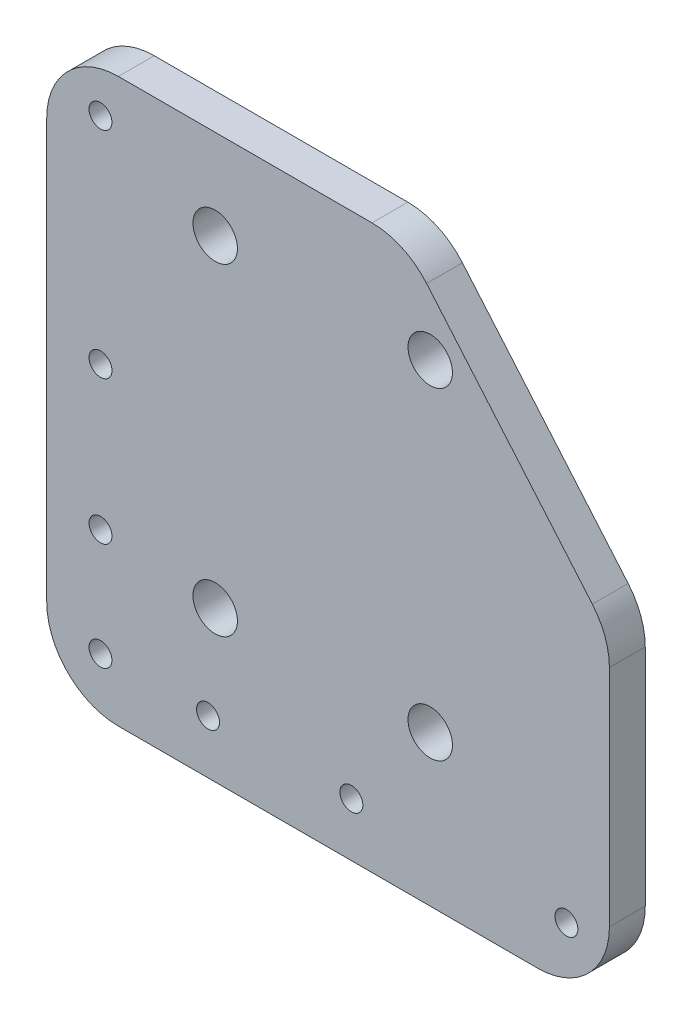
ISO-10303-21;
HEADER;
FILE_DESCRIPTION(('STEP AP214'),'2;1');
FILE_NAME('part.step','',(''),(''),'','','');
FILE_SCHEMA(('AUTOMOTIVE_DESIGN { 1 0 10303 214 1 1 1 1 }'));
ENDSEC;
DATA;
#1=APPLICATION_CONTEXT('core data for automotive mechanical design processes');
#2=APPLICATION_PROTOCOL_DEFINITION('international standard','automotive_design',2000,#1);
#3=PRODUCT_CONTEXT('',#1,'mechanical');
#4=PRODUCT('Part','Part','',(#3));
#5=PRODUCT_RELATED_PRODUCT_CATEGORY('part','',(#4));
#6=PRODUCT_DEFINITION_FORMATION('','',#4);
#7=PRODUCT_DEFINITION_CONTEXT('part definition',#1,'design');
#8=PRODUCT_DEFINITION('design','',#6,#7);
#9=PRODUCT_DEFINITION_SHAPE('','',#8);
#10=(LENGTH_UNIT() NAMED_UNIT(*) SI_UNIT(.MILLI.,.METRE.));
#11=(NAMED_UNIT(*) PLANE_ANGLE_UNIT() SI_UNIT($,.RADIAN.));
#12=(NAMED_UNIT(*) SI_UNIT($,.STERADIAN.) SOLID_ANGLE_UNIT());
#13=UNCERTAINTY_MEASURE_WITH_UNIT(LENGTH_MEASURE(1.E-05),#10,'distance_accuracy_value','');
#14=(GEOMETRIC_REPRESENTATION_CONTEXT(3) GLOBAL_UNCERTAINTY_ASSIGNED_CONTEXT((#13)) GLOBAL_UNIT_ASSIGNED_CONTEXT((#10,
#11,#12)) REPRESENTATION_CONTEXT('',''));
#15=CARTESIAN_POINT('',(0.,0.,0.));
#16=DIRECTION('',(0.,0.,1.));
#17=DIRECTION('',(1.,0.,0.));
#18=AXIS2_PLACEMENT_3D('',#15,#16,#17);
#19=CARTESIAN_POINT('',(0.,0.,5.));
#20=DIRECTION('',(0.,0.,1.));
#21=DIRECTION('',(1.,0.,0.));
#22=AXIS2_PLACEMENT_3D('',#19,#20,#21);
#23=PLANE('',#22);
#24=CARTESIAN_POINT('',(46.,13.5,5.));
#25=DIRECTION('',(0.,0.,1.));
#26=DIRECTION('',(1.,0.,0.));
#27=AXIS2_PLACEMENT_3D('',#24,#25,#26);
#28=CIRCLE('',#27,3.1);
#29=CARTESIAN_POINT('',(49.1,13.5,5.));
#30=VERTEX_POINT('',#29);
#31=EDGE_CURVE('E319',#30,#30,#28,.T.);
#32=ORIENTED_EDGE('',*,*,#31,.F.);
#33=EDGE_LOOP('',(#32));
#34=FACE_BOUND('',#33,.T.);
#35=CARTESIAN_POINT('',(16.,58.5,5.));
#36=DIRECTION('',(0.,0.,1.));
#37=DIRECTION('',(1.,0.,0.));
#38=AXIS2_PLACEMENT_3D('',#35,#36,#37);
#39=CIRCLE('',#38,3.1);
#40=CARTESIAN_POINT('',(19.1,58.5,5.));
#41=VERTEX_POINT('',#40);
#42=EDGE_CURVE('E303',#41,#41,#39,.T.);
#43=ORIENTED_EDGE('',*,*,#42,.F.);
#44=EDGE_LOOP('',(#43));
#45=FACE_BOUND('',#44,.T.);
#46=CARTESIAN_POINT('',(35.,0.,5.));
#47=DIRECTION('',(0.,0.,1.));
#48=DIRECTION('',(1.,0.,0.));
#49=AXIS2_PLACEMENT_3D('',#46,#47,#48);
#50=CIRCLE('',#49,1.60000000000001);
#51=CARTESIAN_POINT('',(36.6,0.,5.));
#52=VERTEX_POINT('',#51);
#53=EDGE_CURVE('E287',#52,#52,#50,.T.);
#54=ORIENTED_EDGE('',*,*,#53,.F.);
#55=EDGE_LOOP('',(#54));
#56=FACE_BOUND('',#55,.T.);
#57=CARTESIAN_POINT('',(0.,65.,5.));
#58=DIRECTION('',(0.,0.,1.));
#59=DIRECTION('',(1.,0.,0.));
#60=AXIS2_PLACEMENT_3D('',#57,#58,#59);
#61=CIRCLE('',#60,1.6);
#62=CARTESIAN_POINT('',(1.6,65.,5.));
#63=VERTEX_POINT('',#62);
#64=EDGE_CURVE('E271',#63,#63,#61,.T.);
#65=ORIENTED_EDGE('',*,*,#64,.F.);
#66=EDGE_LOOP('',(#65));
#67=FACE_BOUND('',#66,.T.);
#68=CARTESIAN_POINT('',(0.,15.,5.));
#69=DIRECTION('',(0.,0.,1.));
#70=DIRECTION('',(1.,0.,0.));
#71=AXIS2_PLACEMENT_3D('',#68,#69,#70);
#72=CIRCLE('',#71,1.6);
#73=CARTESIAN_POINT('',(1.60000000000001,15.,5.));
#74=VERTEX_POINT('',#73);
#75=EDGE_CURVE('E257',#74,#74,#72,.T.);
#76=ORIENTED_EDGE('',*,*,#75,.F.);
#77=EDGE_LOOP('',(#76));
#78=FACE_BOUND('',#77,.T.);
#79=DIRECTION('',(0.,1.,0.));
#80=VECTOR('',#79,1.);
#81=CARTESIAN_POINT('',(71.,-7.5,5.));
#82=LINE('',#81,#80);
#83=CARTESIAN_POINT('',(71.,2.5,5.));
#84=VERTEX_POINT('',#83);
#85=CARTESIAN_POINT('',(71.,33.8217714938602,5.));
#86=VERTEX_POINT('',#85);
#87=EDGE_CURVE('E244',#84,#86,#82,.T.);
#88=ORIENTED_EDGE('',*,*,#87,.T.);
#89=CARTESIAN_POINT('',(61.,33.8217714938602,5.));
#90=DIRECTION('',(0.,0.,1.));
#91=DIRECTION('',(1.,0.,0.));
#92=AXIS2_PLACEMENT_3D('',#89,#90,#91);
#93=CIRCLE('',#92,10.);
#94=CARTESIAN_POINT('',(68.6165875762404,40.3015549542438,5.));
#95=VERTEX_POINT('',#94);
#96=EDGE_CURVE('E193',#86,#95,#93,.T.);
#97=ORIENTED_EDGE('',*,*,#96,.T.);
#98=DIRECTION('',(-0.64797834603836,0.761658757624037,0.));
#99=VECTOR('',#98,1.);
#100=CARTESIAN_POINT('',(71.,37.5,5.));
#101=LINE('',#100,#99);
#102=CARTESIAN_POINT('',(45.4948110859423,67.4797834603836,5.));
#103=VERTEX_POINT('',#102);
#104=EDGE_CURVE('E144',#95,#103,#101,.T.);
#105=ORIENTED_EDGE('',*,*,#104,.T.);
#106=CARTESIAN_POINT('',(37.8782235097019,61.,5.));
#107=DIRECTION('',(0.,0.,1.));
#108=DIRECTION('',(1.,0.,0.));
#109=AXIS2_PLACEMENT_3D('',#106,#107,#108);
#110=CIRCLE('',#109,10.);
#111=CARTESIAN_POINT('',(37.8782235097019,71.,5.));
#112=VERTEX_POINT('',#111);
#113=EDGE_CURVE('E182',#103,#112,#110,.T.);
#114=ORIENTED_EDGE('',*,*,#113,.T.);
#115=DIRECTION('',(-1.,0.,0.));
#116=VECTOR('',#115,1.);
#117=CARTESIAN_POINT('',(42.5,71.,5.));
#118=LINE('',#117,#116);
#119=CARTESIAN_POINT('',(2.5,71.,5.));
#120=VERTEX_POINT('',#119);
#121=EDGE_CURVE('E153',#112,#120,#118,.T.);
#122=ORIENTED_EDGE('',*,*,#121,.T.);
#123=CARTESIAN_POINT('',(2.5,61.,5.));
#124=DIRECTION('',(0.,0.,1.));
#125=DIRECTION('',(1.,0.,0.));
#126=AXIS2_PLACEMENT_3D('',#123,#124,#125);
#127=CIRCLE('',#126,10.);
#128=CARTESIAN_POINT('',(-7.5,61.,5.));
#129=VERTEX_POINT('',#128);
#130=EDGE_CURVE('E185',#120,#129,#127,.T.);
#131=ORIENTED_EDGE('',*,*,#130,.T.);
#132=DIRECTION('',(0.,-1.,0.));
#133=VECTOR('',#132,1.);
#134=CARTESIAN_POINT('',(-7.5,71.,5.));
#135=LINE('',#134,#133);
#136=CARTESIAN_POINT('',(-7.49999999999999,2.5,5.));
#137=VERTEX_POINT('',#136);
#138=EDGE_CURVE('E159',#129,#137,#135,.T.);
#139=ORIENTED_EDGE('',*,*,#138,.T.);
#140=CARTESIAN_POINT('',(2.50000000000001,2.5,5.));
#141=DIRECTION('',(0.,0.,1.));
#142=DIRECTION('',(1.,0.,0.));
#143=AXIS2_PLACEMENT_3D('',#140,#141,#142);
#144=CIRCLE('',#143,10.);
#145=CARTESIAN_POINT('',(2.50000000000001,-7.5,5.));
#146=VERTEX_POINT('',#145);
#147=EDGE_CURVE('E67',#137,#146,#144,.T.);
#148=ORIENTED_EDGE('',*,*,#147,.T.);
#149=DIRECTION('',(1.,0.,0.));
#150=VECTOR('',#149,1.);
#151=CARTESIAN_POINT('',(-7.49999999999999,-7.5,5.));
#152=LINE('',#151,#150);
#153=CARTESIAN_POINT('',(61.,-7.5,5.));
#154=VERTEX_POINT('',#153);
#155=EDGE_CURVE('E245',#146,#154,#152,.T.);
#156=ORIENTED_EDGE('',*,*,#155,.T.);
#157=CARTESIAN_POINT('',(61.,2.5,5.));
#158=DIRECTION('',(0.,0.,1.));
#159=DIRECTION('',(1.,0.,0.));
#160=AXIS2_PLACEMENT_3D('',#157,#158,#159);
#161=CIRCLE('',#160,10.);
#162=EDGE_CURVE('E190',#154,#84,#161,.T.);
#163=ORIENTED_EDGE('',*,*,#162,.T.);
#164=EDGE_LOOP('',(#88,#97,#105,#114,#122,#131,#139,#148,#156,#163));
#165=FACE_BOUND('',#164,.T.);
#166=CARTESIAN_POINT('',(0.,0.,5.));
#167=DIRECTION('',(0.,0.,1.));
#168=DIRECTION('',(1.,0.,0.));
#169=AXIS2_PLACEMENT_3D('',#166,#167,#168);
#170=CIRCLE('',#169,1.6);
#171=CARTESIAN_POINT('',(1.6,0.,5.));
#172=VERTEX_POINT('',#171);
#173=EDGE_CURVE('E222',#172,#172,#170,.T.);
#174=ORIENTED_EDGE('',*,*,#173,.F.);
#175=EDGE_LOOP('',(#174));
#176=FACE_BOUND('',#175,.T.);
#177=CARTESIAN_POINT('',(0.,35.,5.));
#178=DIRECTION('',(0.,0.,1.));
#179=DIRECTION('',(1.,0.,0.));
#180=AXIS2_PLACEMENT_3D('',#177,#178,#179);
#181=CIRCLE('',#180,1.6);
#182=CARTESIAN_POINT('',(1.6,35.,5.));
#183=VERTEX_POINT('',#182);
#184=EDGE_CURVE('E263',#183,#183,#181,.T.);
#185=ORIENTED_EDGE('',*,*,#184,.F.);
#186=EDGE_LOOP('',(#185));
#187=FACE_BOUND('',#186,.T.);
#188=CARTESIAN_POINT('',(15.,0.,5.));
#189=DIRECTION('',(0.,0.,1.));
#190=DIRECTION('',(1.,0.,0.));
#191=AXIS2_PLACEMENT_3D('',#188,#189,#190);
#192=CIRCLE('',#191,1.6);
#193=CARTESIAN_POINT('',(16.6,0.,5.));
#194=VERTEX_POINT('',#193);
#195=EDGE_CURVE('E279',#194,#194,#192,.T.);
#196=ORIENTED_EDGE('',*,*,#195,.F.);
#197=EDGE_LOOP('',(#196));
#198=FACE_BOUND('',#197,.T.);
#199=CARTESIAN_POINT('',(65.,0.,5.));
#200=DIRECTION('',(0.,0.,1.));
#201=DIRECTION('',(1.,0.,0.));
#202=AXIS2_PLACEMENT_3D('',#199,#200,#201);
#203=CIRCLE('',#202,1.60000000000001);
#204=CARTESIAN_POINT('',(66.6,0.,5.));
#205=VERTEX_POINT('',#204);
#206=EDGE_CURVE('E295',#205,#205,#203,.T.);
#207=ORIENTED_EDGE('',*,*,#206,.F.);
#208=EDGE_LOOP('',(#207));
#209=FACE_BOUND('',#208,.T.);
#210=CARTESIAN_POINT('',(16.,13.5,5.));
#211=DIRECTION('',(0.,0.,1.));
#212=DIRECTION('',(1.,0.,0.));
#213=AXIS2_PLACEMENT_3D('',#210,#211,#212);
#214=CIRCLE('',#213,3.1);
#215=CARTESIAN_POINT('',(19.1,13.5,5.));
#216=VERTEX_POINT('',#215);
#217=EDGE_CURVE('E311',#216,#216,#214,.T.);
#218=ORIENTED_EDGE('',*,*,#217,.F.);
#219=EDGE_LOOP('',(#218));
#220=FACE_BOUND('',#219,.T.);
#221=CARTESIAN_POINT('',(46.,58.5,5.));
#222=DIRECTION('',(0.,0.,1.));
#223=DIRECTION('',(1.,0.,0.));
#224=AXIS2_PLACEMENT_3D('',#221,#222,#223);
#225=CIRCLE('',#224,3.09999999999999);
#226=CARTESIAN_POINT('',(49.1,58.5,5.));
#227=VERTEX_POINT('',#226);
#228=EDGE_CURVE('E327',#227,#227,#225,.T.);
#229=ORIENTED_EDGE('',*,*,#228,.F.);
#230=EDGE_LOOP('',(#229));
#231=FACE_BOUND('',#230,.T.);
#232=ADVANCED_FACE('F44',(#34,#45,#56,#67,#78,#165,#176,#187,#198,#209,#220,#231),#23,.T.);
#233=CARTESIAN_POINT('',(0.,0.,0.));
#234=DIRECTION('',(0.,0.,1.));
#235=DIRECTION('',(1.,0.,0.));
#236=AXIS2_PLACEMENT_3D('',#233,#234,#235);
#237=PLANE('',#236);
#238=DIRECTION('',(-0.64797834603836,0.761658757624037,0.));
#239=VECTOR('',#238,1.);
#240=CARTESIAN_POINT('',(71.,37.5,0.));
#241=LINE('',#240,#239);
#242=CARTESIAN_POINT('',(68.6165875762404,40.3015549542438,0.));
#243=VERTEX_POINT('',#242);
#244=CARTESIAN_POINT('',(45.4948110859423,67.4797834603836,0.));
#245=VERTEX_POINT('',#244);
#246=EDGE_CURVE('E141',#243,#245,#241,.T.);
#247=ORIENTED_EDGE('',*,*,#246,.F.);
#248=CARTESIAN_POINT('',(61.,33.8217714938602,0.));
#249=DIRECTION('',(0.,0.,1.));
#250=DIRECTION('',(1.,0.,0.));
#251=AXIS2_PLACEMENT_3D('',#248,#249,#250);
#252=CIRCLE('',#251,10.);
#253=CARTESIAN_POINT('',(71.,33.8217714938602,0.));
#254=VERTEX_POINT('',#253);
#255=EDGE_CURVE('E123',#243,#254,#252,.F.);
#256=ORIENTED_EDGE('',*,*,#255,.T.);
#257=DIRECTION('',(0.,1.,0.));
#258=VECTOR('',#257,1.);
#259=CARTESIAN_POINT('',(71.,-7.5,0.));
#260=LINE('',#259,#258);
#261=CARTESIAN_POINT('',(71.,2.5,0.));
#262=VERTEX_POINT('',#261);
#263=EDGE_CURVE('E154',#262,#254,#260,.T.);
#264=ORIENTED_EDGE('',*,*,#263,.F.);
#265=CARTESIAN_POINT('',(61.,2.5,0.));
#266=DIRECTION('',(0.,0.,1.));
#267=DIRECTION('',(1.,0.,0.));
#268=AXIS2_PLACEMENT_3D('',#265,#266,#267);
#269=CIRCLE('',#268,10.);
#270=CARTESIAN_POINT('',(61.,-7.5,0.));
#271=VERTEX_POINT('',#270);
#272=EDGE_CURVE('E135',#262,#271,#269,.F.);
#273=ORIENTED_EDGE('',*,*,#272,.T.);
#274=DIRECTION('',(1.,0.,0.));
#275=VECTOR('',#274,1.);
#276=CARTESIAN_POINT('',(-7.49999999999999,-7.5,0.));
#277=LINE('',#276,#275);
#278=CARTESIAN_POINT('',(2.50000000000001,-7.5,0.));
#279=VERTEX_POINT('',#278);
#280=EDGE_CURVE('E161',#279,#271,#277,.T.);
#281=ORIENTED_EDGE('',*,*,#280,.F.);
#282=CARTESIAN_POINT('',(2.50000000000001,2.5,0.));
#283=DIRECTION('',(0.,0.,1.));
#284=DIRECTION('',(1.,0.,0.));
#285=AXIS2_PLACEMENT_3D('',#282,#283,#284);
#286=CIRCLE('',#285,10.);
#287=CARTESIAN_POINT('',(-7.49999999999999,2.5,0.));
#288=VERTEX_POINT('',#287);
#289=EDGE_CURVE('E172',#279,#288,#286,.F.);
#290=ORIENTED_EDGE('',*,*,#289,.T.);
#291=DIRECTION('',(0.,-1.,0.));
#292=VECTOR('',#291,1.);
#293=CARTESIAN_POINT('',(-7.5,71.,0.));
#294=LINE('',#293,#292);
#295=CARTESIAN_POINT('',(-7.5,61.,0.));
#296=VERTEX_POINT('',#295);
#297=EDGE_CURVE('E221',#296,#288,#294,.T.);
#298=ORIENTED_EDGE('',*,*,#297,.F.);
#299=CARTESIAN_POINT('',(2.5,61.,0.));
#300=DIRECTION('',(0.,0.,1.));
#301=DIRECTION('',(1.,0.,0.));
#302=AXIS2_PLACEMENT_3D('',#299,#300,#301);
#303=CIRCLE('',#302,10.);
#304=CARTESIAN_POINT('',(2.5,71.,0.));
#305=VERTEX_POINT('',#304);
#306=EDGE_CURVE('E169',#296,#305,#303,.F.);
#307=ORIENTED_EDGE('',*,*,#306,.T.);
#308=DIRECTION('',(-1.,0.,0.));
#309=VECTOR('',#308,1.);
#310=CARTESIAN_POINT('',(42.5,71.,0.));
#311=LINE('',#310,#309);
#312=CARTESIAN_POINT('',(37.8782235097019,71.,0.));
#313=VERTEX_POINT('',#312);
#314=EDGE_CURVE('E215',#313,#305,#311,.T.);
#315=ORIENTED_EDGE('',*,*,#314,.F.);
#316=CARTESIAN_POINT('',(37.8782235097019,61.,0.));
#317=DIRECTION('',(0.,0.,1.));
#318=DIRECTION('',(1.,0.,0.));
#319=AXIS2_PLACEMENT_3D('',#316,#317,#318);
#320=CIRCLE('',#319,10.);
#321=EDGE_CURVE('E146',#313,#245,#320,.F.);
#322=ORIENTED_EDGE('',*,*,#321,.T.);
#323=EDGE_LOOP('',(#247,#256,#264,#273,#281,#290,#298,#307,#315,#322));
#324=FACE_BOUND('',#323,.T.);
#325=CARTESIAN_POINT('',(0.,0.,0.));
#326=DIRECTION('',(0.,0.,1.));
#327=DIRECTION('',(1.,0.,0.));
#328=AXIS2_PLACEMENT_3D('',#325,#326,#327);
#329=CIRCLE('',#328,1.6);
#330=CARTESIAN_POINT('',(1.6,0.,0.));
#331=VERTEX_POINT('',#330);
#332=EDGE_CURVE('E229',#331,#331,#329,.T.);
#333=ORIENTED_EDGE('',*,*,#332,.T.);
#334=EDGE_LOOP('',(#333));
#335=FACE_BOUND('',#334,.T.);
#336=CARTESIAN_POINT('',(0.,15.,0.));
#337=DIRECTION('',(0.,0.,1.));
#338=DIRECTION('',(1.,0.,0.));
#339=AXIS2_PLACEMENT_3D('',#336,#337,#338);
#340=CIRCLE('',#339,1.6);
#341=CARTESIAN_POINT('',(1.60000000000001,15.,0.));
#342=VERTEX_POINT('',#341);
#343=EDGE_CURVE('E259',#342,#342,#340,.T.);
#344=ORIENTED_EDGE('',*,*,#343,.T.);
#345=EDGE_LOOP('',(#344));
#346=FACE_BOUND('',#345,.T.);
#347=CARTESIAN_POINT('',(0.,35.,0.));
#348=DIRECTION('',(0.,0.,1.));
#349=DIRECTION('',(1.,0.,0.));
#350=AXIS2_PLACEMENT_3D('',#347,#348,#349);
#351=CIRCLE('',#350,1.6);
#352=CARTESIAN_POINT('',(1.6,35.,0.));
#353=VERTEX_POINT('',#352);
#354=EDGE_CURVE('E267',#353,#353,#351,.T.);
#355=ORIENTED_EDGE('',*,*,#354,.T.);
#356=EDGE_LOOP('',(#355));
#357=FACE_BOUND('',#356,.T.);
#358=CARTESIAN_POINT('',(0.,65.,0.));
#359=DIRECTION('',(0.,0.,1.));
#360=DIRECTION('',(1.,0.,0.));
#361=AXIS2_PLACEMENT_3D('',#358,#359,#360);
#362=CIRCLE('',#361,1.6);
#363=CARTESIAN_POINT('',(1.6,65.,0.));
#364=VERTEX_POINT('',#363);
#365=EDGE_CURVE('E275',#364,#364,#362,.T.);
#366=ORIENTED_EDGE('',*,*,#365,.T.);
#367=EDGE_LOOP('',(#366));
#368=FACE_BOUND('',#367,.T.);
#369=CARTESIAN_POINT('',(15.,0.,0.));
#370=DIRECTION('',(0.,0.,1.));
#371=DIRECTION('',(1.,0.,0.));
#372=AXIS2_PLACEMENT_3D('',#369,#370,#371);
#373=CIRCLE('',#372,1.6);
#374=CARTESIAN_POINT('',(16.6,0.,0.));
#375=VERTEX_POINT('',#374);
#376=EDGE_CURVE('E283',#375,#375,#373,.T.);
#377=ORIENTED_EDGE('',*,*,#376,.T.);
#378=EDGE_LOOP('',(#377));
#379=FACE_BOUND('',#378,.T.);
#380=CARTESIAN_POINT('',(35.,0.,0.));
#381=DIRECTION('',(0.,0.,1.));
#382=DIRECTION('',(1.,0.,0.));
#383=AXIS2_PLACEMENT_3D('',#380,#381,#382);
#384=CIRCLE('',#383,1.60000000000001);
#385=CARTESIAN_POINT('',(36.6,0.,0.));
#386=VERTEX_POINT('',#385);
#387=EDGE_CURVE('E291',#386,#386,#384,.T.);
#388=ORIENTED_EDGE('',*,*,#387,.T.);
#389=EDGE_LOOP('',(#388));
#390=FACE_BOUND('',#389,.T.);
#391=CARTESIAN_POINT('',(65.,0.,0.));
#392=DIRECTION('',(0.,0.,1.));
#393=DIRECTION('',(1.,0.,0.));
#394=AXIS2_PLACEMENT_3D('',#391,#392,#393);
#395=CIRCLE('',#394,1.60000000000001);
#396=CARTESIAN_POINT('',(66.6,0.,0.));
#397=VERTEX_POINT('',#396);
#398=EDGE_CURVE('E299',#397,#397,#395,.T.);
#399=ORIENTED_EDGE('',*,*,#398,.T.);
#400=EDGE_LOOP('',(#399));
#401=FACE_BOUND('',#400,.T.);
#402=CARTESIAN_POINT('',(16.,58.5,0.));
#403=DIRECTION('',(0.,0.,1.));
#404=DIRECTION('',(1.,0.,0.));
#405=AXIS2_PLACEMENT_3D('',#402,#403,#404);
#406=CIRCLE('',#405,3.1);
#407=CARTESIAN_POINT('',(19.1,58.5,0.));
#408=VERTEX_POINT('',#407);
#409=EDGE_CURVE('E307',#408,#408,#406,.T.);
#410=ORIENTED_EDGE('',*,*,#409,.T.);
#411=EDGE_LOOP('',(#410));
#412=FACE_BOUND('',#411,.T.);
#413=CARTESIAN_POINT('',(16.,13.5,0.));
#414=DIRECTION('',(0.,0.,1.));
#415=DIRECTION('',(1.,0.,0.));
#416=AXIS2_PLACEMENT_3D('',#413,#414,#415);
#417=CIRCLE('',#416,3.1);
#418=CARTESIAN_POINT('',(19.1,13.5,0.));
#419=VERTEX_POINT('',#418);
#420=EDGE_CURVE('E315',#419,#419,#417,.T.);
#421=ORIENTED_EDGE('',*,*,#420,.T.);
#422=EDGE_LOOP('',(#421));
#423=FACE_BOUND('',#422,.T.);
#424=CARTESIAN_POINT('',(46.,13.5,0.));
#425=DIRECTION('',(0.,0.,1.));
#426=DIRECTION('',(1.,0.,0.));
#427=AXIS2_PLACEMENT_3D('',#424,#425,#426);
#428=CIRCLE('',#427,3.1);
#429=CARTESIAN_POINT('',(49.1,13.5,0.));
#430=VERTEX_POINT('',#429);
#431=EDGE_CURVE('E323',#430,#430,#428,.T.);
#432=ORIENTED_EDGE('',*,*,#431,.T.);
#433=EDGE_LOOP('',(#432));
#434=FACE_BOUND('',#433,.T.);
#435=CARTESIAN_POINT('',(46.,58.5,0.));
#436=DIRECTION('',(0.,0.,1.));
#437=DIRECTION('',(1.,0.,0.));
#438=AXIS2_PLACEMENT_3D('',#435,#436,#437);
#439=CIRCLE('',#438,3.09999999999999);
#440=CARTESIAN_POINT('',(49.1,58.5,0.));
#441=VERTEX_POINT('',#440);
#442=EDGE_CURVE('E331',#441,#441,#439,.T.);
#443=ORIENTED_EDGE('',*,*,#442,.T.);
#444=EDGE_LOOP('',(#443));
#445=FACE_BOUND('',#444,.T.);
#446=ADVANCED_FACE('F149',(#324,#335,#346,#357,#368,#379,#390,#401,#412,#423,#434,#445),#237,.F.);
#447=CARTESIAN_POINT('',(42.5,71.,5.));
#448=DIRECTION('',(0.,-1.,0.));
#449=DIRECTION('',(0.,0.,-1.));
#450=AXIS2_PLACEMENT_3D('',#447,#448,#449);
#451=PLANE('',#450);
#452=ORIENTED_EDGE('',*,*,#314,.T.);
#453=DIRECTION('',(0.,0.,-1.));
#454=VECTOR('',#453,1.);
#455=CARTESIAN_POINT('',(2.5,71.,5.));
#456=LINE('',#455,#454);
#457=EDGE_CURVE('E11',#305,#120,#456,.F.);
#458=ORIENTED_EDGE('',*,*,#457,.T.);
#459=ORIENTED_EDGE('',*,*,#121,.F.);
#460=DIRECTION('',(0.,0.,-1.));
#461=VECTOR('',#460,1.);
#462=CARTESIAN_POINT('',(37.8782235097019,71.,5.));
#463=LINE('',#462,#461);
#464=EDGE_CURVE('E53',#112,#313,#463,.T.);
#465=ORIENTED_EDGE('',*,*,#464,.T.);
#466=EDGE_LOOP('',(#452,#458,#459,#465));
#467=FACE_BOUND('',#466,.T.);
#468=ADVANCED_FACE('F214',(#467),#451,.F.);
#469=CARTESIAN_POINT('',(-7.5,71.,5.));
#470=DIRECTION('',(1.,0.,0.));
#471=DIRECTION('',(0.,1.,0.));
#472=AXIS2_PLACEMENT_3D('',#469,#470,#471);
#473=PLANE('',#472);
#474=ORIENTED_EDGE('',*,*,#297,.T.);
#475=DIRECTION('',(0.,0.,-1.));
#476=VECTOR('',#475,1.);
#477=CARTESIAN_POINT('',(-7.49999999999999,2.5,5.));
#478=LINE('',#477,#476);
#479=EDGE_CURVE('E206',#288,#137,#478,.F.);
#480=ORIENTED_EDGE('',*,*,#479,.T.);
#481=ORIENTED_EDGE('',*,*,#138,.F.);
#482=DIRECTION('',(0.,0.,-1.));
#483=VECTOR('',#482,1.);
#484=CARTESIAN_POINT('',(-7.5,61.,5.));
#485=LINE('',#484,#483);
#486=EDGE_CURVE('E202',#129,#296,#485,.T.);
#487=ORIENTED_EDGE('',*,*,#486,.T.);
#488=EDGE_LOOP('',(#474,#480,#481,#487));
#489=FACE_BOUND('',#488,.T.);
#490=ADVANCED_FACE('F362',(#489),#473,.F.);
#491=CARTESIAN_POINT('',(-7.49999999999999,-7.5,5.));
#492=DIRECTION('',(0.,1.,0.));
#493=DIRECTION('',(0.,0.,1.));
#494=AXIS2_PLACEMENT_3D('',#491,#492,#493);
#495=PLANE('',#494);
#496=ORIENTED_EDGE('',*,*,#280,.T.);
#497=DIRECTION('',(0.,0.,-1.));
#498=VECTOR('',#497,1.);
#499=CARTESIAN_POINT('',(61.,-7.5,5.));
#500=LINE('',#499,#498);
#501=EDGE_CURVE('E60',#271,#154,#500,.F.);
#502=ORIENTED_EDGE('',*,*,#501,.T.);
#503=ORIENTED_EDGE('',*,*,#155,.F.);
#504=DIRECTION('',(0.,0.,-1.));
#505=VECTOR('',#504,1.);
#506=CARTESIAN_POINT('',(2.50000000000001,-7.5,5.));
#507=LINE('',#506,#505);
#508=EDGE_CURVE('E196',#146,#279,#507,.T.);
#509=ORIENTED_EDGE('',*,*,#508,.T.);
#510=EDGE_LOOP('',(#496,#502,#503,#509));
#511=FACE_BOUND('',#510,.T.);
#512=ADVANCED_FACE('F235',(#511),#495,.F.);
#513=CARTESIAN_POINT('',(71.,-7.5,5.));
#514=DIRECTION('',(-1.,0.,0.));
#515=DIRECTION('',(0.,0.,1.));
#516=AXIS2_PLACEMENT_3D('',#513,#514,#515);
#517=PLANE('',#516);
#518=ORIENTED_EDGE('',*,*,#263,.T.);
#519=DIRECTION('',(0.,0.,-1.));
#520=VECTOR('',#519,1.);
#521=CARTESIAN_POINT('',(71.,33.8217714938602,5.));
#522=LINE('',#521,#520);
#523=EDGE_CURVE('E128',#254,#86,#522,.F.);
#524=ORIENTED_EDGE('',*,*,#523,.T.);
#525=ORIENTED_EDGE('',*,*,#87,.F.);
#526=DIRECTION('',(0.,0.,-1.));
#527=VECTOR('',#526,1.);
#528=CARTESIAN_POINT('',(71.,2.5,5.));
#529=LINE('',#528,#527);
#530=EDGE_CURVE('E134',#84,#262,#529,.T.);
#531=ORIENTED_EDGE('',*,*,#530,.T.);
#532=EDGE_LOOP('',(#518,#524,#525,#531));
#533=FACE_BOUND('',#532,.T.);
#534=ADVANCED_FACE('F247',(#533),#517,.F.);
#535=CARTESIAN_POINT('',(71.,37.5,5.));
#536=DIRECTION('',(-0.761658757624037,-0.64797834603836,0.));
#537=DIRECTION('',(0.64797834603836,-0.761658757624037,0.));
#538=AXIS2_PLACEMENT_3D('',#535,#536,#537);
#539=PLANE('',#538);
#540=ORIENTED_EDGE('',*,*,#104,.F.);
#541=DIRECTION('',(0.,0.,-1.));
#542=VECTOR('',#541,1.);
#543=CARTESIAN_POINT('',(68.6165875762404,40.3015549542438,5.));
#544=LINE('',#543,#542);
#545=EDGE_CURVE('E127',#95,#243,#544,.T.);
#546=ORIENTED_EDGE('',*,*,#545,.T.);
#547=ORIENTED_EDGE('',*,*,#246,.T.);
#548=DIRECTION('',(0.,0.,-1.));
#549=VECTOR('',#548,1.);
#550=CARTESIAN_POINT('',(45.4948110859423,67.4797834603836,5.));
#551=LINE('',#550,#549);
#552=EDGE_CURVE('E147',#245,#103,#551,.F.);
#553=ORIENTED_EDGE('',*,*,#552,.T.);
#554=EDGE_LOOP('',(#540,#546,#547,#553));
#555=FACE_BOUND('',#554,.T.);
#556=ADVANCED_FACE('F140',(#555),#539,.F.);
#557=CARTESIAN_POINT('',(0.,0.,5.));
#558=DIRECTION('',(0.,0.,-1.));
#559=DIRECTION('',(-1.,0.,0.));
#560=AXIS2_PLACEMENT_3D('',#557,#558,#559);
#561=CYLINDRICAL_SURFACE('',#560,1.6);
#562=ORIENTED_EDGE('',*,*,#173,.T.);
#563=EDGE_LOOP('',(#562));
#564=FACE_BOUND('',#563,.T.);
#565=ORIENTED_EDGE('',*,*,#332,.F.);
#566=EDGE_LOOP('',(#565));
#567=FACE_BOUND('',#566,.T.);
#568=ADVANCED_FACE('F353',(#564,#567),#561,.F.);
#569=CARTESIAN_POINT('',(0.,15.,5.));
#570=DIRECTION('',(0.,0.,-1.));
#571=DIRECTION('',(-1.,0.,0.));
#572=AXIS2_PLACEMENT_3D('',#569,#570,#571);
#573=CYLINDRICAL_SURFACE('',#572,1.6);
#574=ORIENTED_EDGE('',*,*,#75,.T.);
#575=EDGE_LOOP('',(#574));
#576=FACE_BOUND('',#575,.T.);
#577=ORIENTED_EDGE('',*,*,#343,.F.);
#578=EDGE_LOOP('',(#577));
#579=FACE_BOUND('',#578,.T.);
#580=ADVANCED_FACE('F497',(#576,#579),#573,.F.);
#581=CARTESIAN_POINT('',(0.,35.,5.));
#582=DIRECTION('',(0.,0.,-1.));
#583=DIRECTION('',(-1.,0.,0.));
#584=AXIS2_PLACEMENT_3D('',#581,#582,#583);
#585=CYLINDRICAL_SURFACE('',#584,1.6);
#586=ORIENTED_EDGE('',*,*,#184,.T.);
#587=EDGE_LOOP('',(#586));
#588=FACE_BOUND('',#587,.T.);
#589=ORIENTED_EDGE('',*,*,#354,.F.);
#590=EDGE_LOOP('',(#589));
#591=FACE_BOUND('',#590,.T.);
#592=ADVANCED_FACE('F487',(#588,#591),#585,.F.);
#593=CARTESIAN_POINT('',(0.,65.,5.));
#594=DIRECTION('',(0.,0.,-1.));
#595=DIRECTION('',(-1.,0.,0.));
#596=AXIS2_PLACEMENT_3D('',#593,#594,#595);
#597=CYLINDRICAL_SURFACE('',#596,1.6);
#598=ORIENTED_EDGE('',*,*,#64,.T.);
#599=EDGE_LOOP('',(#598));
#600=FACE_BOUND('',#599,.T.);
#601=ORIENTED_EDGE('',*,*,#365,.F.);
#602=EDGE_LOOP('',(#601));
#603=FACE_BOUND('',#602,.T.);
#604=ADVANCED_FACE('F477',(#600,#603),#597,.F.);
#605=CARTESIAN_POINT('',(15.,0.,5.));
#606=DIRECTION('',(0.,0.,-1.));
#607=DIRECTION('',(-1.,0.,0.));
#608=AXIS2_PLACEMENT_3D('',#605,#606,#607);
#609=CYLINDRICAL_SURFACE('',#608,1.6);
#610=ORIENTED_EDGE('',*,*,#195,.T.);
#611=EDGE_LOOP('',(#610));
#612=FACE_BOUND('',#611,.T.);
#613=ORIENTED_EDGE('',*,*,#376,.F.);
#614=EDGE_LOOP('',(#613));
#615=FACE_BOUND('',#614,.T.);
#616=ADVANCED_FACE('F467',(#612,#615),#609,.F.);
#617=CARTESIAN_POINT('',(35.,0.,5.));
#618=DIRECTION('',(0.,0.,-1.));
#619=DIRECTION('',(-1.,0.,0.));
#620=AXIS2_PLACEMENT_3D('',#617,#618,#619);
#621=CYLINDRICAL_SURFACE('',#620,1.60000000000001);
#622=ORIENTED_EDGE('',*,*,#53,.T.);
#623=EDGE_LOOP('',(#622));
#624=FACE_BOUND('',#623,.T.);
#625=ORIENTED_EDGE('',*,*,#387,.F.);
#626=EDGE_LOOP('',(#625));
#627=FACE_BOUND('',#626,.T.);
#628=ADVANCED_FACE('F457',(#624,#627),#621,.F.);
#629=CARTESIAN_POINT('',(65.,0.,5.));
#630=DIRECTION('',(0.,0.,-1.));
#631=DIRECTION('',(-1.,0.,0.));
#632=AXIS2_PLACEMENT_3D('',#629,#630,#631);
#633=CYLINDRICAL_SURFACE('',#632,1.60000000000001);
#634=ORIENTED_EDGE('',*,*,#206,.T.);
#635=EDGE_LOOP('',(#634));
#636=FACE_BOUND('',#635,.T.);
#637=ORIENTED_EDGE('',*,*,#398,.F.);
#638=EDGE_LOOP('',(#637));
#639=FACE_BOUND('',#638,.T.);
#640=ADVANCED_FACE('F447',(#636,#639),#633,.F.);
#641=CARTESIAN_POINT('',(16.,58.5,5.));
#642=DIRECTION('',(0.,0.,-1.));
#643=DIRECTION('',(-1.,0.,0.));
#644=AXIS2_PLACEMENT_3D('',#641,#642,#643);
#645=CYLINDRICAL_SURFACE('',#644,3.1);
#646=ORIENTED_EDGE('',*,*,#42,.T.);
#647=EDGE_LOOP('',(#646));
#648=FACE_BOUND('',#647,.T.);
#649=ORIENTED_EDGE('',*,*,#409,.F.);
#650=EDGE_LOOP('',(#649));
#651=FACE_BOUND('',#650,.T.);
#652=ADVANCED_FACE('F437',(#648,#651),#645,.F.);
#653=CARTESIAN_POINT('',(16.,13.5,5.));
#654=DIRECTION('',(0.,0.,-1.));
#655=DIRECTION('',(-1.,0.,0.));
#656=AXIS2_PLACEMENT_3D('',#653,#654,#655);
#657=CYLINDRICAL_SURFACE('',#656,3.1);
#658=ORIENTED_EDGE('',*,*,#217,.T.);
#659=EDGE_LOOP('',(#658));
#660=FACE_BOUND('',#659,.T.);
#661=ORIENTED_EDGE('',*,*,#420,.F.);
#662=EDGE_LOOP('',(#661));
#663=FACE_BOUND('',#662,.T.);
#664=ADVANCED_FACE('F427',(#660,#663),#657,.F.);
#665=CARTESIAN_POINT('',(46.,13.5,5.));
#666=DIRECTION('',(0.,0.,-1.));
#667=DIRECTION('',(-1.,0.,0.));
#668=AXIS2_PLACEMENT_3D('',#665,#666,#667);
#669=CYLINDRICAL_SURFACE('',#668,3.1);
#670=ORIENTED_EDGE('',*,*,#31,.T.);
#671=EDGE_LOOP('',(#670));
#672=FACE_BOUND('',#671,.T.);
#673=ORIENTED_EDGE('',*,*,#431,.F.);
#674=EDGE_LOOP('',(#673));
#675=FACE_BOUND('',#674,.T.);
#676=ADVANCED_FACE('F418',(#672,#675),#669,.F.);
#677=CARTESIAN_POINT('',(46.,58.5,5.));
#678=DIRECTION('',(0.,0.,-1.));
#679=DIRECTION('',(-1.,0.,0.));
#680=AXIS2_PLACEMENT_3D('',#677,#678,#679);
#681=CYLINDRICAL_SURFACE('',#680,3.09999999999999);
#682=ORIENTED_EDGE('',*,*,#228,.T.);
#683=EDGE_LOOP('',(#682));
#684=FACE_BOUND('',#683,.T.);
#685=ORIENTED_EDGE('',*,*,#442,.F.);
#686=EDGE_LOOP('',(#685));
#687=FACE_BOUND('',#686,.T.);
#688=ADVANCED_FACE('F339',(#684,#687),#681,.F.);
#689=CARTESIAN_POINT('',(61.,33.8217714938602,5.));
#690=DIRECTION('',(0.,0.,-1.));
#691=DIRECTION('',(-1.,0.,0.));
#692=AXIS2_PLACEMENT_3D('',#689,#690,#691);
#693=CYLINDRICAL_SURFACE('',#692,10.);
#694=ORIENTED_EDGE('',*,*,#96,.F.);
#695=ORIENTED_EDGE('',*,*,#523,.F.);
#696=ORIENTED_EDGE('',*,*,#255,.F.);
#697=ORIENTED_EDGE('',*,*,#545,.F.);
#698=EDGE_LOOP('',(#694,#695,#696,#697));
#699=FACE_BOUND('',#698,.T.);
#700=ADVANCED_FACE('F126',(#699),#693,.T.);
#701=CARTESIAN_POINT('',(61.,2.5,5.));
#702=DIRECTION('',(0.,0.,-1.));
#703=DIRECTION('',(-1.,0.,0.));
#704=AXIS2_PLACEMENT_3D('',#701,#702,#703);
#705=CYLINDRICAL_SURFACE('',#704,10.);
#706=ORIENTED_EDGE('',*,*,#162,.F.);
#707=ORIENTED_EDGE('',*,*,#501,.F.);
#708=ORIENTED_EDGE('',*,*,#272,.F.);
#709=ORIENTED_EDGE('',*,*,#530,.F.);
#710=EDGE_LOOP('',(#706,#707,#708,#709));
#711=FACE_BOUND('',#710,.T.);
#712=ADVANCED_FACE('F239',(#711),#705,.T.);
#713=CARTESIAN_POINT('',(2.50000000000001,2.5,5.));
#714=DIRECTION('',(0.,0.,-1.));
#715=DIRECTION('',(-1.,0.,0.));
#716=AXIS2_PLACEMENT_3D('',#713,#714,#715);
#717=CYLINDRICAL_SURFACE('',#716,10.);
#718=ORIENTED_EDGE('',*,*,#147,.F.);
#719=ORIENTED_EDGE('',*,*,#479,.F.);
#720=ORIENTED_EDGE('',*,*,#289,.F.);
#721=ORIENTED_EDGE('',*,*,#508,.F.);
#722=EDGE_LOOP('',(#718,#719,#720,#721));
#723=FACE_BOUND('',#722,.T.);
#724=ADVANCED_FACE('F372',(#723),#717,.T.);
#725=CARTESIAN_POINT('',(2.5,61.,5.));
#726=DIRECTION('',(0.,0.,-1.));
#727=DIRECTION('',(-1.,0.,0.));
#728=AXIS2_PLACEMENT_3D('',#725,#726,#727);
#729=CYLINDRICAL_SURFACE('',#728,10.);
#730=ORIENTED_EDGE('',*,*,#130,.F.);
#731=ORIENTED_EDGE('',*,*,#457,.F.);
#732=ORIENTED_EDGE('',*,*,#306,.F.);
#733=ORIENTED_EDGE('',*,*,#486,.F.);
#734=EDGE_LOOP('',(#730,#731,#732,#733));
#735=FACE_BOUND('',#734,.T.);
#736=ADVANCED_FACE('F374',(#735),#729,.T.);
#737=CARTESIAN_POINT('',(37.8782235097019,61.,5.));
#738=DIRECTION('',(0.,0.,-1.));
#739=DIRECTION('',(-1.,0.,0.));
#740=AXIS2_PLACEMENT_3D('',#737,#738,#739);
#741=CYLINDRICAL_SURFACE('',#740,10.);
#742=ORIENTED_EDGE('',*,*,#113,.F.);
#743=ORIENTED_EDGE('',*,*,#552,.F.);
#744=ORIENTED_EDGE('',*,*,#321,.F.);
#745=ORIENTED_EDGE('',*,*,#464,.F.);
#746=EDGE_LOOP('',(#742,#743,#744,#745));
#747=FACE_BOUND('',#746,.T.);
#748=ADVANCED_FACE('F46',(#747),#741,.T.);
#749=CLOSED_SHELL('',(#232,#446,#468,#490,#512,#534,#556,#568,#580,#592,#604,#616,#628,#640,
#652,#664,#676,#688,#700,#712,#724,#736,#748));
#750=MANIFOLD_SOLID_BREP('B2',#749);
#751=ADVANCED_BREP_SHAPE_REPRESENTATION('',(#18,#750),#14);
#752=SHAPE_DEFINITION_REPRESENTATION(#9,#751);
ENDSEC;
END-ISO-10303-21;
